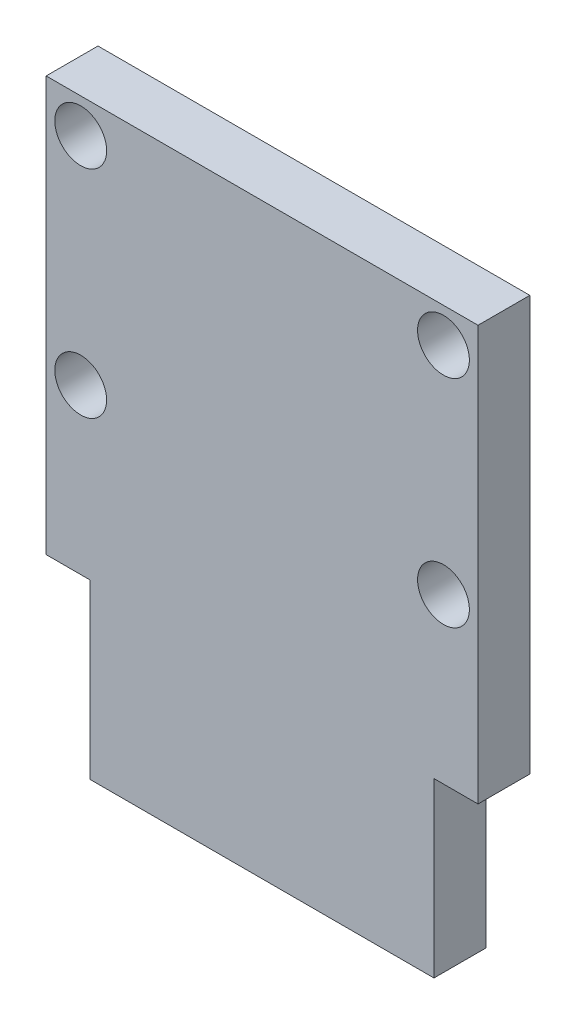
ISO-10303-21;
HEADER;
FILE_DESCRIPTION(('STEP AP214'),'2;1');
FILE_NAME('part.step','',(''),(''),'','','');
FILE_SCHEMA(('AUTOMOTIVE_DESIGN { 1 0 10303 214 1 1 1 1 }'));
ENDSEC;
DATA;
#1=APPLICATION_CONTEXT('core data for automotive mechanical design processes');
#2=APPLICATION_PROTOCOL_DEFINITION('international standard','automotive_design',2000,#1);
#3=PRODUCT_CONTEXT('',#1,'mechanical');
#4=PRODUCT('Part','Part','',(#3));
#5=PRODUCT_RELATED_PRODUCT_CATEGORY('part','',(#4));
#6=PRODUCT_DEFINITION_FORMATION('','',#4);
#7=PRODUCT_DEFINITION_CONTEXT('part definition',#1,'design');
#8=PRODUCT_DEFINITION('design','',#6,#7);
#9=PRODUCT_DEFINITION_SHAPE('','',#8);
#10=(LENGTH_UNIT() NAMED_UNIT(*) SI_UNIT(.MILLI.,.METRE.));
#11=(NAMED_UNIT(*) PLANE_ANGLE_UNIT() SI_UNIT($,.RADIAN.));
#12=(NAMED_UNIT(*) SI_UNIT($,.STERADIAN.) SOLID_ANGLE_UNIT());
#13=UNCERTAINTY_MEASURE_WITH_UNIT(LENGTH_MEASURE(1.E-05),#10,'distance_accuracy_value','');
#14=(GEOMETRIC_REPRESENTATION_CONTEXT(3) GLOBAL_UNCERTAINTY_ASSIGNED_CONTEXT((#13)) GLOBAL_UNIT_ASSIGNED_CONTEXT((#10,
#11,#12)) REPRESENTATION_CONTEXT('',''));
#15=CARTESIAN_POINT('',(0.,0.,0.));
#16=DIRECTION('',(0.,0.,1.));
#17=DIRECTION('',(1.,0.,0.));
#18=AXIS2_PLACEMENT_3D('',#15,#16,#17);
#19=CARTESIAN_POINT('',(0.,0.,3.));
#20=DIRECTION('',(0.,1.,0.));
#21=DIRECTION('',(0.,0.,1.));
#22=AXIS2_PLACEMENT_3D('',#19,#20,#21);
#23=PLANE('',#22);
#24=DIRECTION('',(1.,0.,0.));
#25=VECTOR('',#24,1.);
#26=CARTESIAN_POINT('',(0.,0.,0.));
#27=LINE('',#26,#25);
#28=CARTESIAN_POINT('',(0.,0.,0.));
#29=VERTEX_POINT('',#28);
#30=CARTESIAN_POINT('',(2.55,0.,0.));
#31=VERTEX_POINT('',#30);
#32=EDGE_CURVE('E162',#29,#31,#27,.T.);
#33=ORIENTED_EDGE('',*,*,#32,.T.);
#34=DIRECTION('',(0.,0.,-1.));
#35=VECTOR('',#34,1.);
#36=CARTESIAN_POINT('',(2.55,0.,3.));
#37=LINE('',#36,#35);
#38=CARTESIAN_POINT('',(2.55,0.,3.));
#39=VERTEX_POINT('',#38);
#40=EDGE_CURVE('E11',#39,#31,#37,.T.);
#41=ORIENTED_EDGE('',*,*,#40,.F.);
#42=DIRECTION('',(1.,0.,0.));
#43=VECTOR('',#42,1.);
#44=CARTESIAN_POINT('',(0.,0.,3.));
#45=LINE('',#44,#43);
#46=CARTESIAN_POINT('',(0.,0.,3.));
#47=VERTEX_POINT('',#46);
#48=EDGE_CURVE('E227',#47,#39,#45,.T.);
#49=ORIENTED_EDGE('',*,*,#48,.F.);
#50=DIRECTION('',(0.,0.,-1.));
#51=VECTOR('',#50,1.);
#52=CARTESIAN_POINT('',(0.,0.,3.));
#53=LINE('',#52,#51);
#54=EDGE_CURVE('E59',#47,#29,#53,.T.);
#55=ORIENTED_EDGE('',*,*,#54,.T.);
#56=EDGE_LOOP('',(#33,#41,#49,#55));
#57=FACE_BOUND('',#56,.T.);
#58=ADVANCED_FACE('F41',(#57),#23,.F.);
#59=CARTESIAN_POINT('',(2.55,0.,3.));
#60=DIRECTION('',(1.,0.,0.));
#61=DIRECTION('',(0.,1.,0.));
#62=AXIS2_PLACEMENT_3D('',#59,#60,#61);
#63=PLANE('',#62);
#64=DIRECTION('',(0.,-1.,0.));
#65=VECTOR('',#64,1.);
#66=CARTESIAN_POINT('',(2.55,0.,0.));
#67=LINE('',#66,#65);
#68=CARTESIAN_POINT('',(2.55,-10.,0.));
#69=VERTEX_POINT('',#68);
#70=EDGE_CURVE('E165',#31,#69,#67,.T.);
#71=ORIENTED_EDGE('',*,*,#70,.T.);
#72=DIRECTION('',(0.,0.,-1.));
#73=VECTOR('',#72,1.);
#74=CARTESIAN_POINT('',(2.55,-10.,3.));
#75=LINE('',#74,#73);
#76=CARTESIAN_POINT('',(2.55,-10.,3.));
#77=VERTEX_POINT('',#76);
#78=EDGE_CURVE('E51',#77,#69,#75,.T.);
#79=ORIENTED_EDGE('',*,*,#78,.F.);
#80=DIRECTION('',(0.,-1.,0.));
#81=VECTOR('',#80,1.);
#82=CARTESIAN_POINT('',(2.55,0.,3.));
#83=LINE('',#82,#81);
#84=EDGE_CURVE('E97',#39,#77,#83,.T.);
#85=ORIENTED_EDGE('',*,*,#84,.F.);
#86=ORIENTED_EDGE('',*,*,#40,.T.);
#87=EDGE_LOOP('',(#71,#79,#85,#86));
#88=FACE_BOUND('',#87,.T.);
#89=ADVANCED_FACE('F264',(#88),#63,.F.);
#90=CARTESIAN_POINT('',(0.,-10.,3.));
#91=DIRECTION('',(0.,1.,0.));
#92=DIRECTION('',(0.,0.,1.));
#93=AXIS2_PLACEMENT_3D('',#90,#91,#92);
#94=PLANE('',#93);
#95=DIRECTION('',(1.,0.,0.));
#96=VECTOR('',#95,1.);
#97=CARTESIAN_POINT('',(0.,-10.,0.));
#98=LINE('',#97,#96);
#99=CARTESIAN_POINT('',(22.45,-10.,0.));
#100=VERTEX_POINT('',#99);
#101=EDGE_CURVE('E169',#69,#100,#98,.T.);
#102=ORIENTED_EDGE('',*,*,#101,.T.);
#103=DIRECTION('',(0.,0.,-1.));
#104=VECTOR('',#103,1.);
#105=CARTESIAN_POINT('',(22.45,-10.,3.));
#106=LINE('',#105,#104);
#107=CARTESIAN_POINT('',(22.45,-10.,3.));
#108=VERTEX_POINT('',#107);
#109=EDGE_CURVE('E204',#108,#100,#106,.T.);
#110=ORIENTED_EDGE('',*,*,#109,.F.);
#111=DIRECTION('',(1.,0.,0.));
#112=VECTOR('',#111,1.);
#113=CARTESIAN_POINT('',(0.,-10.,3.));
#114=LINE('',#113,#112);
#115=EDGE_CURVE('E213',#77,#108,#114,.T.);
#116=ORIENTED_EDGE('',*,*,#115,.F.);
#117=ORIENTED_EDGE('',*,*,#78,.T.);
#118=EDGE_LOOP('',(#102,#110,#116,#117));
#119=FACE_BOUND('',#118,.T.);
#120=ADVANCED_FACE('F211',(#119),#94,.F.);
#121=CARTESIAN_POINT('',(22.45,0.,3.));
#122=DIRECTION('',(1.,0.,0.));
#123=DIRECTION('',(0.,1.,0.));
#124=AXIS2_PLACEMENT_3D('',#121,#122,#123);
#125=PLANE('',#124);
#126=DIRECTION('',(0.,-1.,0.));
#127=VECTOR('',#126,1.);
#128=CARTESIAN_POINT('',(22.45,0.,0.));
#129=LINE('',#128,#127);
#130=CARTESIAN_POINT('',(22.45,0.,0.));
#131=VERTEX_POINT('',#130);
#132=EDGE_CURVE('E173',#131,#100,#129,.T.);
#133=ORIENTED_EDGE('',*,*,#132,.F.);
#134=DIRECTION('',(0.,0.,-1.));
#135=VECTOR('',#134,1.);
#136=CARTESIAN_POINT('',(22.45,0.,3.));
#137=LINE('',#136,#135);
#138=CARTESIAN_POINT('',(22.45,0.,3.));
#139=VERTEX_POINT('',#138);
#140=EDGE_CURVE('E201',#139,#131,#137,.T.);
#141=ORIENTED_EDGE('',*,*,#140,.F.);
#142=DIRECTION('',(0.,-1.,0.));
#143=VECTOR('',#142,1.);
#144=CARTESIAN_POINT('',(22.45,0.,3.));
#145=LINE('',#144,#143);
#146=EDGE_CURVE('E222',#139,#108,#145,.T.);
#147=ORIENTED_EDGE('',*,*,#146,.T.);
#148=ORIENTED_EDGE('',*,*,#109,.T.);
#149=EDGE_LOOP('',(#133,#141,#147,#148));
#150=FACE_BOUND('',#149,.T.);
#151=ADVANCED_FACE('F220',(#150),#125,.T.);
#152=CARTESIAN_POINT('',(25.,0.,0.));
#153=VERTEX_POINT('',#152);
#154=EDGE_CURVE('E166',#131,#153,#27,.T.);
#155=ORIENTED_EDGE('',*,*,#154,.T.);
#156=DIRECTION('',(0.,0.,-1.));
#157=VECTOR('',#156,1.);
#158=CARTESIAN_POINT('',(25.,0.,3.));
#159=LINE('',#158,#157);
#160=CARTESIAN_POINT('',(25.,0.,3.));
#161=VERTEX_POINT('',#160);
#162=EDGE_CURVE('E136',#161,#153,#159,.T.);
#163=ORIENTED_EDGE('',*,*,#162,.F.);
#164=EDGE_CURVE('E122',#139,#161,#45,.T.);
#165=ORIENTED_EDGE('',*,*,#164,.F.);
#166=ORIENTED_EDGE('',*,*,#140,.T.);
#167=EDGE_LOOP('',(#155,#163,#165,#166));
#168=FACE_BOUND('',#167,.T.);
#169=ADVANCED_FACE('F266',(#168),#23,.F.);
#170=CARTESIAN_POINT('',(25.,0.,3.));
#171=DIRECTION('',(-1.,0.,0.));
#172=DIRECTION('',(0.,0.,1.));
#173=AXIS2_PLACEMENT_3D('',#170,#171,#172);
#174=PLANE('',#173);
#175=DIRECTION('',(0.,1.,0.));
#176=VECTOR('',#175,1.);
#177=CARTESIAN_POINT('',(25.,0.,0.));
#178=LINE('',#177,#176);
#179=CARTESIAN_POINT('',(25.,24.,0.));
#180=VERTEX_POINT('',#179);
#181=EDGE_CURVE('E132',#153,#180,#178,.T.);
#182=ORIENTED_EDGE('',*,*,#181,.T.);
#183=DIRECTION('',(0.,0.,-1.));
#184=VECTOR('',#183,1.);
#185=CARTESIAN_POINT('',(25.,24.,3.));
#186=LINE('',#185,#184);
#187=CARTESIAN_POINT('',(25.,24.,3.));
#188=VERTEX_POINT('',#187);
#189=EDGE_CURVE('E129',#188,#180,#186,.T.);
#190=ORIENTED_EDGE('',*,*,#189,.F.);
#191=DIRECTION('',(0.,1.,0.));
#192=VECTOR('',#191,1.);
#193=CARTESIAN_POINT('',(25.,0.,3.));
#194=LINE('',#193,#192);
#195=EDGE_CURVE('E113',#161,#188,#194,.T.);
#196=ORIENTED_EDGE('',*,*,#195,.F.);
#197=ORIENTED_EDGE('',*,*,#162,.T.);
#198=EDGE_LOOP('',(#182,#190,#196,#197));
#199=FACE_BOUND('',#198,.T.);
#200=ADVANCED_FACE('F130',(#199),#174,.F.);
#201=CARTESIAN_POINT('',(0.,24.,3.));
#202=DIRECTION('',(0.,1.,0.));
#203=DIRECTION('',(0.,0.,1.));
#204=AXIS2_PLACEMENT_3D('',#201,#202,#203);
#205=PLANE('',#204);
#206=DIRECTION('',(1.,0.,0.));
#207=VECTOR('',#206,1.);
#208=CARTESIAN_POINT('',(0.,24.,0.));
#209=LINE('',#208,#207);
#210=CARTESIAN_POINT('',(0.,24.,0.));
#211=VERTEX_POINT('',#210);
#212=EDGE_CURVE('E179',#211,#180,#209,.T.);
#213=ORIENTED_EDGE('',*,*,#212,.F.);
#214=DIRECTION('',(0.,0.,-1.));
#215=VECTOR('',#214,1.);
#216=CARTESIAN_POINT('',(0.,24.,3.));
#217=LINE('',#216,#215);
#218=CARTESIAN_POINT('',(0.,24.,3.));
#219=VERTEX_POINT('',#218);
#220=EDGE_CURVE('E85',#219,#211,#217,.T.);
#221=ORIENTED_EDGE('',*,*,#220,.F.);
#222=DIRECTION('',(1.,0.,0.));
#223=VECTOR('',#222,1.);
#224=CARTESIAN_POINT('',(0.,24.,3.));
#225=LINE('',#224,#223);
#226=EDGE_CURVE('E119',#219,#188,#225,.T.);
#227=ORIENTED_EDGE('',*,*,#226,.T.);
#228=ORIENTED_EDGE('',*,*,#189,.T.);
#229=EDGE_LOOP('',(#213,#221,#227,#228));
#230=FACE_BOUND('',#229,.T.);
#231=ADVANCED_FACE('F138',(#230),#205,.T.);
#232=CARTESIAN_POINT('',(23.,9.5,3.));
#233=DIRECTION('',(0.,0.,-1.));
#234=DIRECTION('',(-1.,0.,0.));
#235=AXIS2_PLACEMENT_3D('',#232,#233,#234);
#236=CYLINDRICAL_SURFACE('',#235,1.5);
#237=CARTESIAN_POINT('',(23.,9.5,3.));
#238=DIRECTION('',(0.,0.,1.));
#239=DIRECTION('',(1.,0.,0.));
#240=AXIS2_PLACEMENT_3D('',#237,#238,#239);
#241=CIRCLE('',#240,1.5);
#242=CARTESIAN_POINT('',(24.5,9.5,3.));
#243=VERTEX_POINT('',#242);
#244=EDGE_CURVE('E143',#243,#243,#241,.T.);
#245=ORIENTED_EDGE('',*,*,#244,.T.);
#246=EDGE_LOOP('',(#245));
#247=FACE_BOUND('',#246,.T.);
#248=CARTESIAN_POINT('',(23.,9.5,0.));
#249=DIRECTION('',(0.,0.,1.));
#250=DIRECTION('',(1.,0.,0.));
#251=AXIS2_PLACEMENT_3D('',#248,#249,#250);
#252=CIRCLE('',#251,1.5);
#253=CARTESIAN_POINT('',(24.5,9.5,0.));
#254=VERTEX_POINT('',#253);
#255=EDGE_CURVE('E186',#254,#254,#252,.T.);
#256=ORIENTED_EDGE('',*,*,#255,.F.);
#257=EDGE_LOOP('',(#256));
#258=FACE_BOUND('',#257,.T.);
#259=ADVANCED_FACE('F260',(#247,#258),#236,.F.);
#260=CARTESIAN_POINT('',(0.,0.,3.));
#261=DIRECTION('',(-1.,0.,0.));
#262=DIRECTION('',(0.,0.,1.));
#263=AXIS2_PLACEMENT_3D('',#260,#261,#262);
#264=PLANE('',#263);
#265=DIRECTION('',(0.,1.,0.));
#266=VECTOR('',#265,1.);
#267=CARTESIAN_POINT('',(0.,0.,0.));
#268=LINE('',#267,#266);
#269=EDGE_CURVE('E182',#29,#211,#268,.T.);
#270=ORIENTED_EDGE('',*,*,#269,.F.);
#271=ORIENTED_EDGE('',*,*,#54,.F.);
#272=DIRECTION('',(0.,1.,0.));
#273=VECTOR('',#272,1.);
#274=CARTESIAN_POINT('',(0.,0.,3.));
#275=LINE('',#274,#273);
#276=EDGE_CURVE('E140',#47,#219,#275,.T.);
#277=ORIENTED_EDGE('',*,*,#276,.T.);
#278=ORIENTED_EDGE('',*,*,#220,.T.);
#279=EDGE_LOOP('',(#270,#271,#277,#278));
#280=FACE_BOUND('',#279,.T.);
#281=ADVANCED_FACE('F255',(#280),#264,.T.);
#282=CARTESIAN_POINT('',(2.,22.,3.));
#283=DIRECTION('',(0.,0.,-1.));
#284=DIRECTION('',(-1.,0.,0.));
#285=AXIS2_PLACEMENT_3D('',#282,#283,#284);
#286=CYLINDRICAL_SURFACE('',#285,1.5);
#287=CARTESIAN_POINT('',(2.,22.,3.));
#288=DIRECTION('',(0.,0.,1.));
#289=DIRECTION('',(1.,0.,0.));
#290=AXIS2_PLACEMENT_3D('',#287,#288,#289);
#291=CIRCLE('',#290,1.5);
#292=CARTESIAN_POINT('',(3.5,22.,3.));
#293=VERTEX_POINT('',#292);
#294=EDGE_CURVE('E233',#293,#293,#291,.T.);
#295=ORIENTED_EDGE('',*,*,#294,.T.);
#296=EDGE_LOOP('',(#295));
#297=FACE_BOUND('',#296,.T.);
#298=CARTESIAN_POINT('',(2.,22.,0.));
#299=DIRECTION('',(0.,0.,1.));
#300=DIRECTION('',(1.,0.,0.));
#301=AXIS2_PLACEMENT_3D('',#298,#299,#300);
#302=CIRCLE('',#301,1.5);
#303=CARTESIAN_POINT('',(3.5,22.,0.));
#304=VERTEX_POINT('',#303);
#305=EDGE_CURVE('E158',#304,#304,#302,.T.);
#306=ORIENTED_EDGE('',*,*,#305,.F.);
#307=EDGE_LOOP('',(#306));
#308=FACE_BOUND('',#307,.T.);
#309=ADVANCED_FACE('F246',(#297,#308),#286,.F.);
#310=CARTESIAN_POINT('',(23.,22.,3.));
#311=DIRECTION('',(0.,0.,-1.));
#312=DIRECTION('',(-1.,0.,0.));
#313=AXIS2_PLACEMENT_3D('',#310,#311,#312);
#314=CYLINDRICAL_SURFACE('',#313,1.5);
#315=CARTESIAN_POINT('',(23.,22.,3.));
#316=DIRECTION('',(0.,0.,1.));
#317=DIRECTION('',(1.,0.,0.));
#318=AXIS2_PLACEMENT_3D('',#315,#316,#317);
#319=CIRCLE('',#318,1.5);
#320=CARTESIAN_POINT('',(24.5,22.,3.));
#321=VERTEX_POINT('',#320);
#322=EDGE_CURVE('E194',#321,#321,#319,.F.);
#323=ORIENTED_EDGE('',*,*,#322,.F.);
#324=EDGE_LOOP('',(#323));
#325=FACE_BOUND('',#324,.T.);
#326=CARTESIAN_POINT('',(23.,22.,0.));
#327=DIRECTION('',(0.,0.,1.));
#328=DIRECTION('',(1.,0.,0.));
#329=AXIS2_PLACEMENT_3D('',#326,#327,#328);
#330=CIRCLE('',#329,1.5);
#331=CARTESIAN_POINT('',(24.5,22.,0.));
#332=VERTEX_POINT('',#331);
#333=EDGE_CURVE('E154',#332,#332,#330,.F.);
#334=ORIENTED_EDGE('',*,*,#333,.T.);
#335=EDGE_LOOP('',(#334));
#336=FACE_BOUND('',#335,.T.);
#337=ADVANCED_FACE('F43',(#325,#336),#314,.F.);
#338=CARTESIAN_POINT('',(2.,9.5,3.));
#339=DIRECTION('',(0.,0.,-1.));
#340=DIRECTION('',(-1.,0.,0.));
#341=AXIS2_PLACEMENT_3D('',#338,#339,#340);
#342=CYLINDRICAL_SURFACE('',#341,1.5);
#343=CARTESIAN_POINT('',(2.,9.5,3.));
#344=DIRECTION('',(0.,0.,1.));
#345=DIRECTION('',(1.,0.,0.));
#346=AXIS2_PLACEMENT_3D('',#343,#344,#345);
#347=CIRCLE('',#346,1.5);
#348=CARTESIAN_POINT('',(3.5,9.5,3.));
#349=VERTEX_POINT('',#348);
#350=EDGE_CURVE('E150',#349,#349,#347,.F.);
#351=ORIENTED_EDGE('',*,*,#350,.F.);
#352=EDGE_LOOP('',(#351));
#353=FACE_BOUND('',#352,.T.);
#354=CARTESIAN_POINT('',(2.,9.5,0.));
#355=DIRECTION('',(0.,0.,1.));
#356=DIRECTION('',(1.,0.,0.));
#357=AXIS2_PLACEMENT_3D('',#354,#355,#356);
#358=CIRCLE('',#357,1.5);
#359=CARTESIAN_POINT('',(3.5,9.5,0.));
#360=VERTEX_POINT('',#359);
#361=EDGE_CURVE('E190',#360,#360,#358,.F.);
#362=ORIENTED_EDGE('',*,*,#361,.T.);
#363=EDGE_LOOP('',(#362));
#364=FACE_BOUND('',#363,.T.);
#365=ADVANCED_FACE('F245',(#353,#364),#342,.F.);
#366=CARTESIAN_POINT('',(0.,0.,3.));
#367=DIRECTION('',(0.,0.,1.));
#368=DIRECTION('',(1.,0.,0.));
#369=AXIS2_PLACEMENT_3D('',#366,#367,#368);
#370=PLANE('',#369);
#371=ORIENTED_EDGE('',*,*,#322,.T.);
#372=EDGE_LOOP('',(#371));
#373=FACE_BOUND('',#372,.T.);
#374=ORIENTED_EDGE('',*,*,#294,.F.);
#375=EDGE_LOOP('',(#374));
#376=FACE_BOUND('',#375,.T.);
#377=ORIENTED_EDGE('',*,*,#48,.T.);
#378=ORIENTED_EDGE('',*,*,#84,.T.);
#379=ORIENTED_EDGE('',*,*,#115,.T.);
#380=ORIENTED_EDGE('',*,*,#146,.F.);
#381=ORIENTED_EDGE('',*,*,#164,.T.);
#382=ORIENTED_EDGE('',*,*,#195,.T.);
#383=ORIENTED_EDGE('',*,*,#226,.F.);
#384=ORIENTED_EDGE('',*,*,#276,.F.);
#385=EDGE_LOOP('',(#377,#378,#379,#380,#381,#382,#383,#384));
#386=FACE_BOUND('',#385,.T.);
#387=ORIENTED_EDGE('',*,*,#244,.F.);
#388=EDGE_LOOP('',(#387));
#389=FACE_BOUND('',#388,.T.);
#390=ORIENTED_EDGE('',*,*,#350,.T.);
#391=EDGE_LOOP('',(#390));
#392=FACE_BOUND('',#391,.T.);
#393=ADVANCED_FACE('F115',(#373,#376,#386,#389,#392),#370,.T.);
#394=CARTESIAN_POINT('',(0.,0.,0.));
#395=DIRECTION('',(0.,0.,1.));
#396=DIRECTION('',(1.,0.,0.));
#397=AXIS2_PLACEMENT_3D('',#394,#395,#396);
#398=PLANE('',#397);
#399=ORIENTED_EDGE('',*,*,#333,.F.);
#400=EDGE_LOOP('',(#399));
#401=FACE_BOUND('',#400,.T.);
#402=ORIENTED_EDGE('',*,*,#305,.T.);
#403=EDGE_LOOP('',(#402));
#404=FACE_BOUND('',#403,.T.);
#405=ORIENTED_EDGE('',*,*,#32,.F.);
#406=ORIENTED_EDGE('',*,*,#269,.T.);
#407=ORIENTED_EDGE('',*,*,#212,.T.);
#408=ORIENTED_EDGE('',*,*,#181,.F.);
#409=ORIENTED_EDGE('',*,*,#154,.F.);
#410=ORIENTED_EDGE('',*,*,#132,.T.);
#411=ORIENTED_EDGE('',*,*,#101,.F.);
#412=ORIENTED_EDGE('',*,*,#70,.F.);
#413=EDGE_LOOP('',(#405,#406,#407,#408,#409,#410,#411,#412));
#414=FACE_BOUND('',#413,.T.);
#415=ORIENTED_EDGE('',*,*,#255,.T.);
#416=EDGE_LOOP('',(#415));
#417=FACE_BOUND('',#416,.T.);
#418=ORIENTED_EDGE('',*,*,#361,.F.);
#419=EDGE_LOOP('',(#418));
#420=FACE_BOUND('',#419,.T.);
#421=ADVANCED_FACE('F215',(#401,#404,#414,#417,#420),#398,.F.);
#422=CLOSED_SHELL('',(#58,#89,#120,#151,#169,#200,#231,#259,#281,#309,#337,#365,#393,#421));
#423=MANIFOLD_SOLID_BREP('B2',#422);
#424=ADVANCED_BREP_SHAPE_REPRESENTATION('',(#18,#423),#14);
#425=SHAPE_DEFINITION_REPRESENTATION(#9,#424);
ENDSEC;
END-ISO-10303-21;
